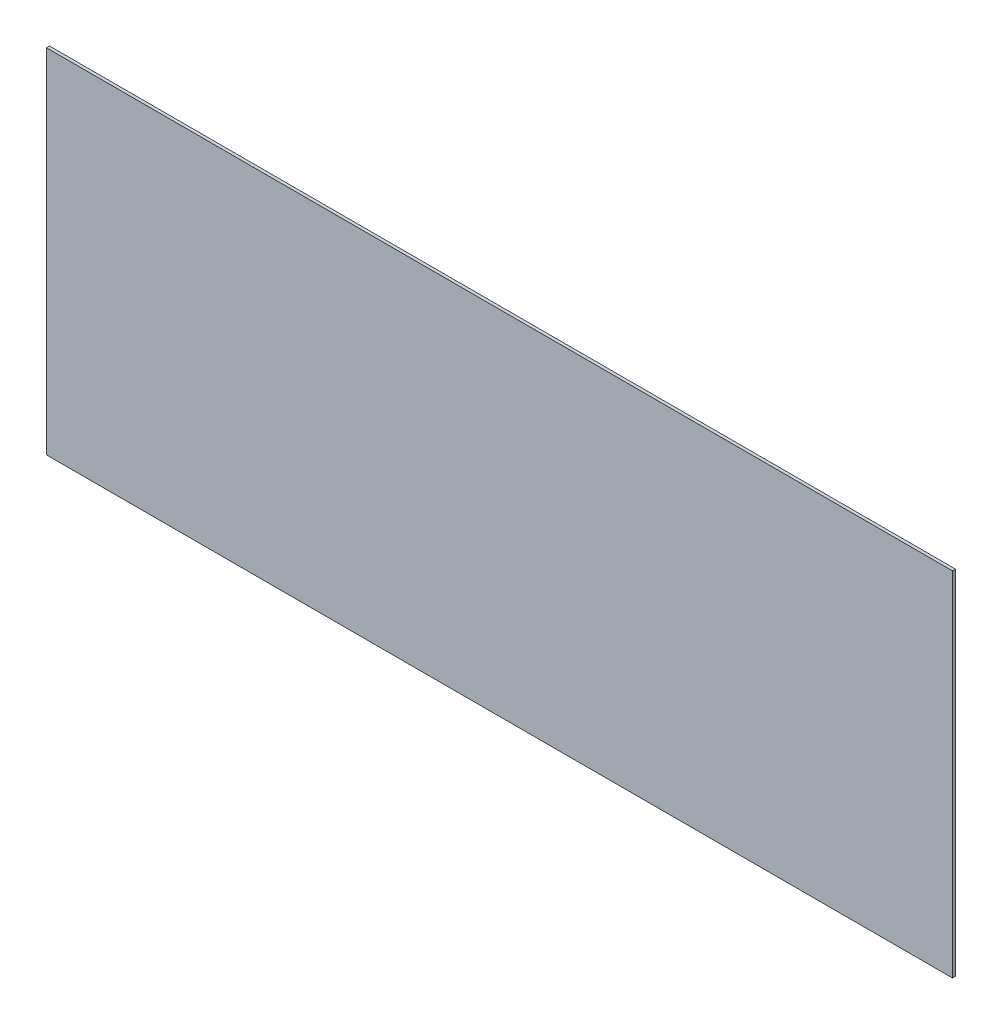
ISO-10303-21;
HEADER;
FILE_DESCRIPTION(('STEP AP214'),'2;1');
FILE_NAME('part.step','',(''),(''),'','','');
FILE_SCHEMA(('AUTOMOTIVE_DESIGN { 1 0 10303 214 1 1 1 1 }'));
ENDSEC;
DATA;
#1=APPLICATION_CONTEXT('core data for automotive mechanical design processes');
#2=APPLICATION_PROTOCOL_DEFINITION('international standard','automotive_design',2000,#1);
#3=PRODUCT_CONTEXT('',#1,'mechanical');
#4=PRODUCT('Part','Part','',(#3));
#5=PRODUCT_RELATED_PRODUCT_CATEGORY('part','',(#4));
#6=PRODUCT_DEFINITION_FORMATION('','',#4);
#7=PRODUCT_DEFINITION_CONTEXT('part definition',#1,'design');
#8=PRODUCT_DEFINITION('design','',#6,#7);
#9=PRODUCT_DEFINITION_SHAPE('','',#8);
#10=(LENGTH_UNIT() NAMED_UNIT(*) SI_UNIT(.MILLI.,.METRE.));
#11=(NAMED_UNIT(*) PLANE_ANGLE_UNIT() SI_UNIT($,.RADIAN.));
#12=(NAMED_UNIT(*) SI_UNIT($,.STERADIAN.) SOLID_ANGLE_UNIT());
#13=UNCERTAINTY_MEASURE_WITH_UNIT(LENGTH_MEASURE(1.E-05),#10,'distance_accuracy_value','');
#14=(GEOMETRIC_REPRESENTATION_CONTEXT(3) GLOBAL_UNCERTAINTY_ASSIGNED_CONTEXT((#13)) GLOBAL_UNIT_ASSIGNED_CONTEXT((#10,
#11,#12)) REPRESENTATION_CONTEXT('',''));
#15=CARTESIAN_POINT('',(0.,0.,0.));
#16=DIRECTION('',(0.,0.,1.));
#17=DIRECTION('',(1.,0.,0.));
#18=AXIS2_PLACEMENT_3D('',#15,#16,#17);
#19=CARTESIAN_POINT('',(474.765,184.765,3.175));
#20=DIRECTION('',(-1.,0.,0.));
#21=DIRECTION('',(0.,0.,1.));
#22=AXIS2_PLACEMENT_3D('',#19,#20,#21);
#23=PLANE('',#22);
#24=DIRECTION('',(0.,1.,0.));
#25=VECTOR('',#24,1.);
#26=CARTESIAN_POINT('',(474.765,184.765,0.));
#27=LINE('',#26,#25);
#28=CARTESIAN_POINT('',(474.765,-184.765,0.));
#29=VERTEX_POINT('',#28);
#30=CARTESIAN_POINT('',(474.765,184.765,0.));
#31=VERTEX_POINT('',#30);
#32=EDGE_CURVE('E113',#29,#31,#27,.T.);
#33=ORIENTED_EDGE('',*,*,#32,.T.);
#34=DIRECTION('',(0.,0.,-1.));
#35=VECTOR('',#34,1.);
#36=CARTESIAN_POINT('',(474.765,184.765,3.175));
#37=LINE('',#36,#35);
#38=CARTESIAN_POINT('',(474.765,184.765,3.175));
#39=VERTEX_POINT('',#38);
#40=EDGE_CURVE('E11',#39,#31,#37,.T.);
#41=ORIENTED_EDGE('',*,*,#40,.F.);
#42=DIRECTION('',(0.,1.,0.));
#43=VECTOR('',#42,1.);
#44=CARTESIAN_POINT('',(474.765,184.765,3.175));
#45=LINE('',#44,#43);
#46=CARTESIAN_POINT('',(474.765,-184.765,3.175));
#47=VERTEX_POINT('',#46);
#48=EDGE_CURVE('E97',#47,#39,#45,.T.);
#49=ORIENTED_EDGE('',*,*,#48,.F.);
#50=DIRECTION('',(0.,0.,-1.));
#51=VECTOR('',#50,1.);
#52=CARTESIAN_POINT('',(474.765,-184.765,3.175));
#53=LINE('',#52,#51);
#54=EDGE_CURVE('E109',#47,#29,#53,.T.);
#55=ORIENTED_EDGE('',*,*,#54,.T.);
#56=EDGE_LOOP('',(#33,#41,#49,#55));
#57=FACE_BOUND('',#56,.T.);
#58=ADVANCED_FACE('F45',(#57),#23,.F.);
#59=CARTESIAN_POINT('',(-474.765,184.765,3.175));
#60=DIRECTION('',(0.,-1.,0.));
#61=DIRECTION('',(0.,0.,-1.));
#62=AXIS2_PLACEMENT_3D('',#59,#60,#61);
#63=PLANE('',#62);
#64=DIRECTION('',(-1.,0.,0.));
#65=VECTOR('',#64,1.);
#66=CARTESIAN_POINT('',(-474.765,184.765,0.));
#67=LINE('',#66,#65);
#68=CARTESIAN_POINT('',(-474.765,184.765,0.));
#69=VERTEX_POINT('',#68);
#70=EDGE_CURVE('E102',#31,#69,#67,.T.);
#71=ORIENTED_EDGE('',*,*,#70,.T.);
#72=DIRECTION('',(0.,0.,-1.));
#73=VECTOR('',#72,1.);
#74=CARTESIAN_POINT('',(-474.765,184.765,3.175));
#75=LINE('',#74,#73);
#76=CARTESIAN_POINT('',(-474.765,184.765,3.175));
#77=VERTEX_POINT('',#76);
#78=EDGE_CURVE('E54',#77,#69,#75,.T.);
#79=ORIENTED_EDGE('',*,*,#78,.F.);
#80=DIRECTION('',(-1.,0.,0.));
#81=VECTOR('',#80,1.);
#82=CARTESIAN_POINT('',(-474.765,184.765,3.175));
#83=LINE('',#82,#81);
#84=EDGE_CURVE('E92',#39,#77,#83,.T.);
#85=ORIENTED_EDGE('',*,*,#84,.F.);
#86=ORIENTED_EDGE('',*,*,#40,.T.);
#87=EDGE_LOOP('',(#71,#79,#85,#86));
#88=FACE_BOUND('',#87,.T.);
#89=ADVANCED_FACE('F101',(#88),#63,.F.);
#90=CARTESIAN_POINT('',(-474.765,184.765,3.175));
#91=DIRECTION('',(1.,0.,0.));
#92=DIRECTION('',(0.,0.,-1.));
#93=AXIS2_PLACEMENT_3D('',#90,#91,#92);
#94=PLANE('',#93);
#95=DIRECTION('',(0.,-1.,0.));
#96=VECTOR('',#95,1.);
#97=CARTESIAN_POINT('',(-474.765,184.765,0.));
#98=LINE('',#97,#96);
#99=CARTESIAN_POINT('',(-474.765,-184.765,0.));
#100=VERTEX_POINT('',#99);
#101=EDGE_CURVE('E79',#69,#100,#98,.T.);
#102=ORIENTED_EDGE('',*,*,#101,.T.);
#103=DIRECTION('',(0.,0.,-1.));
#104=VECTOR('',#103,1.);
#105=CARTESIAN_POINT('',(-474.765,-184.765,3.175));
#106=LINE('',#105,#104);
#107=CARTESIAN_POINT('',(-474.765,-184.765,3.175));
#108=VERTEX_POINT('',#107);
#109=EDGE_CURVE('E104',#108,#100,#106,.T.);
#110=ORIENTED_EDGE('',*,*,#109,.F.);
#111=DIRECTION('',(0.,-1.,0.));
#112=VECTOR('',#111,1.);
#113=CARTESIAN_POINT('',(-474.765,184.765,3.175));
#114=LINE('',#113,#112);
#115=EDGE_CURVE('E95',#77,#108,#114,.T.);
#116=ORIENTED_EDGE('',*,*,#115,.F.);
#117=ORIENTED_EDGE('',*,*,#78,.T.);
#118=EDGE_LOOP('',(#102,#110,#116,#117));
#119=FACE_BOUND('',#118,.T.);
#120=ADVANCED_FACE('F105',(#119),#94,.F.);
#121=CARTESIAN_POINT('',(-474.765,-184.765,3.175));
#122=DIRECTION('',(0.,1.,0.));
#123=DIRECTION('',(0.,0.,1.));
#124=AXIS2_PLACEMENT_3D('',#121,#122,#123);
#125=PLANE('',#124);
#126=DIRECTION('',(1.,0.,0.));
#127=VECTOR('',#126,1.);
#128=CARTESIAN_POINT('',(-474.765,-184.765,0.));
#129=LINE('',#128,#127);
#130=EDGE_CURVE('E85',#100,#29,#129,.T.);
#131=ORIENTED_EDGE('',*,*,#130,.T.);
#132=ORIENTED_EDGE('',*,*,#54,.F.);
#133=DIRECTION('',(1.,0.,0.));
#134=VECTOR('',#133,1.);
#135=CARTESIAN_POINT('',(-474.765,-184.765,3.175));
#136=LINE('',#135,#134);
#137=EDGE_CURVE('E62',#108,#47,#136,.T.);
#138=ORIENTED_EDGE('',*,*,#137,.F.);
#139=ORIENTED_EDGE('',*,*,#109,.T.);
#140=EDGE_LOOP('',(#131,#132,#138,#139));
#141=FACE_BOUND('',#140,.T.);
#142=ADVANCED_FACE('F126',(#141),#125,.F.);
#143=CARTESIAN_POINT('',(0.,0.,3.175));
#144=DIRECTION('',(0.,0.,1.));
#145=DIRECTION('',(1.,0.,0.));
#146=AXIS2_PLACEMENT_3D('',#143,#144,#145);
#147=PLANE('',#146);
#148=ORIENTED_EDGE('',*,*,#48,.T.);
#149=ORIENTED_EDGE('',*,*,#84,.T.);
#150=ORIENTED_EDGE('',*,*,#115,.T.);
#151=ORIENTED_EDGE('',*,*,#137,.T.);
#152=EDGE_LOOP('',(#148,#149,#150,#151));
#153=FACE_BOUND('',#152,.T.);
#154=ADVANCED_FACE('F93',(#153),#147,.T.);
#155=CARTESIAN_POINT('',(0.,0.,0.));
#156=DIRECTION('',(0.,0.,1.));
#157=DIRECTION('',(1.,0.,0.));
#158=AXIS2_PLACEMENT_3D('',#155,#156,#157);
#159=PLANE('',#158);
#160=ORIENTED_EDGE('',*,*,#32,.F.);
#161=ORIENTED_EDGE('',*,*,#130,.F.);
#162=ORIENTED_EDGE('',*,*,#101,.F.);
#163=ORIENTED_EDGE('',*,*,#70,.F.);
#164=EDGE_LOOP('',(#160,#161,#162,#163));
#165=FACE_BOUND('',#164,.T.);
#166=ADVANCED_FACE('F129',(#165),#159,.F.);
#167=CLOSED_SHELL('',(#58,#89,#120,#142,#154,#166));
#168=MANIFOLD_SOLID_BREP('B2',#167);
#169=ADVANCED_BREP_SHAPE_REPRESENTATION('',(#18,#168),#14);
#170=SHAPE_DEFINITION_REPRESENTATION(#9,#169);
ENDSEC;
END-ISO-10303-21;
